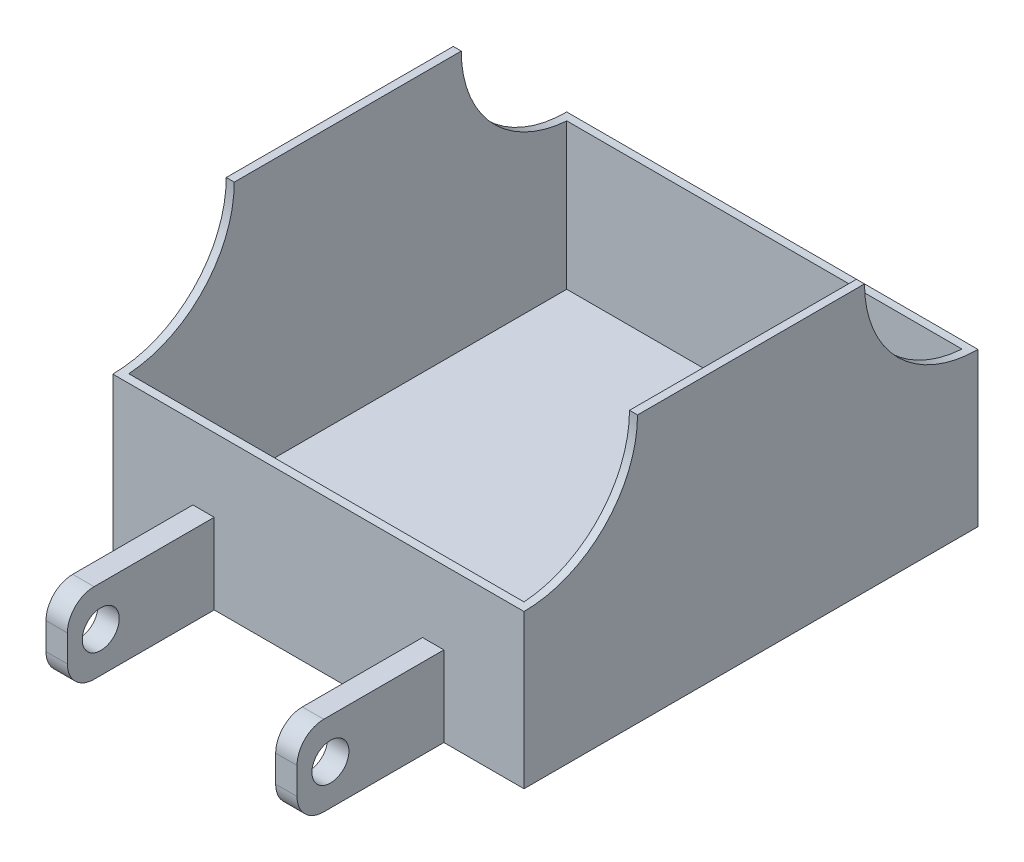
ISO-10303-21;
HEADER;
FILE_DESCRIPTION(('STEP AP214'),'2;1');
FILE_NAME('part.step','',(''),(''),'','','');
FILE_SCHEMA(('AUTOMOTIVE_DESIGN { 1 0 10303 214 1 1 1 1 }'));
ENDSEC;
DATA;
#1=APPLICATION_CONTEXT('core data for automotive mechanical design processes');
#2=APPLICATION_PROTOCOL_DEFINITION('international standard','automotive_design',2000,#1);
#3=PRODUCT_CONTEXT('',#1,'mechanical');
#4=PRODUCT('Part','Part','',(#3));
#5=PRODUCT_RELATED_PRODUCT_CATEGORY('part','',(#4));
#6=PRODUCT_DEFINITION_FORMATION('','',#4);
#7=PRODUCT_DEFINITION_CONTEXT('part definition',#1,'design');
#8=PRODUCT_DEFINITION('design','',#6,#7);
#9=PRODUCT_DEFINITION_SHAPE('','',#8);
#10=(LENGTH_UNIT() NAMED_UNIT(*) SI_UNIT(.MILLI.,.METRE.));
#11=(NAMED_UNIT(*) PLANE_ANGLE_UNIT() SI_UNIT($,.RADIAN.));
#12=(NAMED_UNIT(*) SI_UNIT($,.STERADIAN.) SOLID_ANGLE_UNIT());
#13=UNCERTAINTY_MEASURE_WITH_UNIT(LENGTH_MEASURE(1.E-05),#10,'distance_accuracy_value','');
#14=(GEOMETRIC_REPRESENTATION_CONTEXT(3) GLOBAL_UNCERTAINTY_ASSIGNED_CONTEXT((#13)) GLOBAL_UNIT_ASSIGNED_CONTEXT((#10,
#11,#12)) REPRESENTATION_CONTEXT('',''));
#15=CARTESIAN_POINT('',(0.,0.,0.));
#16=DIRECTION('',(0.,0.,1.));
#17=DIRECTION('',(1.,0.,0.));
#18=AXIS2_PLACEMENT_3D('',#15,#16,#17);
#19=CARTESIAN_POINT('',(154.,50.,85.));
#20=DIRECTION('',(0.,-1.,0.));
#21=DIRECTION('',(0.,0.,-1.));
#22=AXIS2_PLACEMENT_3D('',#19,#20,#21);
#23=PLANE('',#22);
#24=DIRECTION('',(0.,0.,1.));
#25=VECTOR('',#24,1.);
#26=CARTESIAN_POINT('',(154.,50.,85.));
#27=LINE('',#26,#25);
#28=CARTESIAN_POINT('',(154.,50.,-42.5));
#29=VERTEX_POINT('',#28);
#30=CARTESIAN_POINT('',(154.,50.,42.5));
#31=VERTEX_POINT('',#30);
#32=EDGE_CURVE('E209',#29,#31,#27,.T.);
#33=ORIENTED_EDGE('',*,*,#32,.F.);
#34=DIRECTION('',(1.,0.,0.));
#35=VECTOR('',#34,1.);
#36=CARTESIAN_POINT('',(-120.208152801713,50.,-42.5));
#37=LINE('',#36,#35);
#38=CARTESIAN_POINT('',(151.,50.,-42.5));
#39=VERTEX_POINT('',#38);
#40=EDGE_CURVE('E332',#29,#39,#37,.F.);
#41=ORIENTED_EDGE('',*,*,#40,.T.);
#42=DIRECTION('',(0.,0.,1.));
#43=VECTOR('',#42,1.);
#44=CARTESIAN_POINT('',(151.,50.,0.));
#45=LINE('',#44,#43);
#46=CARTESIAN_POINT('',(151.,50.,42.5));
#47=VERTEX_POINT('',#46);
#48=EDGE_CURVE('E211',#39,#47,#45,.T.);
#49=ORIENTED_EDGE('',*,*,#48,.T.);
#50=DIRECTION('',(1.,0.,0.));
#51=VECTOR('',#50,1.);
#52=CARTESIAN_POINT('',(-120.208152801713,50.,42.5));
#53=LINE('',#52,#51);
#54=EDGE_CURVE('E196',#47,#31,#53,.T.);
#55=ORIENTED_EDGE('',*,*,#54,.T.);
#56=EDGE_LOOP('',(#33,#41,#49,#55));
#57=FACE_BOUND('',#56,.T.);
#58=ADVANCED_FACE('F35',(#57),#23,.F.);
#59=CARTESIAN_POINT('',(30.,-19.9407530090241,140.));
#60=DIRECTION('',(0.,1.,0.));
#61=DIRECTION('',(0.,0.,1.));
#62=AXIS2_PLACEMENT_3D('',#59,#60,#61);
#63=PLANE('',#62);
#64=DIRECTION('',(0.,0.,-1.));
#65=VECTOR('',#64,1.);
#66=CARTESIAN_POINT('',(30.,-19.9407530090241,140.));
#67=LINE('',#66,#65);
#68=CARTESIAN_POINT('',(30.,-19.9407530090241,130.));
#69=VERTEX_POINT('',#68);
#70=CARTESIAN_POINT('',(30.,-19.9407530090241,85.));
#71=VERTEX_POINT('',#70);
#72=EDGE_CURVE('E383',#69,#71,#67,.T.);
#73=ORIENTED_EDGE('',*,*,#72,.F.);
#74=DIRECTION('',(1.,0.,0.));
#75=VECTOR('',#74,1.);
#76=CARTESIAN_POINT('',(38.,-19.9407530090241,130.));
#77=LINE('',#76,#75);
#78=CARTESIAN_POINT('',(38.,-19.9407530090241,130.));
#79=VERTEX_POINT('',#78);
#80=EDGE_CURVE('E268',#69,#79,#77,.T.);
#81=ORIENTED_EDGE('',*,*,#80,.T.);
#82=DIRECTION('',(0.,0.,1.));
#83=VECTOR('',#82,1.);
#84=CARTESIAN_POINT('',(38.,-19.9407530090241,85.));
#85=LINE('',#84,#83);
#86=CARTESIAN_POINT('',(38.,-19.9407530090241,85.));
#87=VERTEX_POINT('',#86);
#88=EDGE_CURVE('E364',#87,#79,#85,.T.);
#89=ORIENTED_EDGE('',*,*,#88,.F.);
#90=DIRECTION('',(1.,0.,0.));
#91=VECTOR('',#90,1.);
#92=CARTESIAN_POINT('',(30.,-19.9407530090241,85.));
#93=LINE('',#92,#91);
#94=EDGE_CURVE('E387',#71,#87,#93,.T.);
#95=ORIENTED_EDGE('',*,*,#94,.F.);
#96=EDGE_LOOP('',(#73,#81,#89,#95));
#97=FACE_BOUND('',#96,.T.);
#98=ADVANCED_FACE('F411',(#97),#63,.T.);
#99=CARTESIAN_POINT('',(0.,0.,140.));
#100=DIRECTION('',(0.,0.,-1.));
#101=DIRECTION('',(-1.,0.,0.));
#102=AXIS2_PLACEMENT_3D('',#99,#100,#101);
#103=PLANE('',#102);
#104=DIRECTION('',(0.,1.,0.));
#105=VECTOR('',#104,1.);
#106=CARTESIAN_POINT('',(30.,-50.,140.));
#107=LINE('',#106,#105);
#108=CARTESIAN_POINT('',(30.,-40.,140.));
#109=VERTEX_POINT('',#108);
#110=CARTESIAN_POINT('',(30.,-29.9407530090241,140.));
#111=VERTEX_POINT('',#110);
#112=EDGE_CURVE('E376',#109,#111,#107,.T.);
#113=ORIENTED_EDGE('',*,*,#112,.F.);
#114=DIRECTION('',(1.,0.,0.));
#115=VECTOR('',#114,1.);
#116=CARTESIAN_POINT('',(0.,-40.,140.));
#117=LINE('',#116,#115);
#118=CARTESIAN_POINT('',(38.,-40.,140.));
#119=VERTEX_POINT('',#118);
#120=EDGE_CURVE('E253',#109,#119,#117,.T.);
#121=ORIENTED_EDGE('',*,*,#120,.T.);
#122=DIRECTION('',(0.,-1.,0.));
#123=VECTOR('',#122,1.);
#124=CARTESIAN_POINT('',(38.,-50.,140.));
#125=LINE('',#124,#123);
#126=CARTESIAN_POINT('',(38.,-29.9407530090241,140.));
#127=VERTEX_POINT('',#126);
#128=EDGE_CURVE('E348',#127,#119,#125,.T.);
#129=ORIENTED_EDGE('',*,*,#128,.F.);
#130=DIRECTION('',(1.,0.,0.));
#131=VECTOR('',#130,1.);
#132=CARTESIAN_POINT('',(30.,-29.9407530090241,140.));
#133=LINE('',#132,#131);
#134=EDGE_CURVE('E246',#127,#111,#133,.F.);
#135=ORIENTED_EDGE('',*,*,#134,.T.);
#136=EDGE_LOOP('',(#113,#121,#129,#135));
#137=FACE_BOUND('',#136,.T.);
#138=ADVANCED_FACE('F474',(#137),#103,.F.);
#139=DIRECTION('',(0.,0.,1.));
#140=VECTOR('',#139,1.);
#141=CARTESIAN_POINT('',(3.,50.,0.));
#142=LINE('',#141,#140);
#143=CARTESIAN_POINT('',(3.,50.,-42.5));
#144=VERTEX_POINT('',#143);
#145=CARTESIAN_POINT('',(3.,50.,42.5));
#146=VERTEX_POINT('',#145);
#147=EDGE_CURVE('E294',#144,#146,#142,.T.);
#148=ORIENTED_EDGE('',*,*,#147,.F.);
#149=CARTESIAN_POINT('',(0.,50.,-42.5));
#150=VERTEX_POINT('',#149);
#151=EDGE_CURVE('E58',#144,#150,#37,.F.);
#152=ORIENTED_EDGE('',*,*,#151,.T.);
#153=DIRECTION('',(0.,0.,1.));
#154=VECTOR('',#153,1.);
#155=CARTESIAN_POINT('',(0.,50.,85.));
#156=LINE('',#155,#154);
#157=CARTESIAN_POINT('',(0.,50.,42.5));
#158=VERTEX_POINT('',#157);
#159=EDGE_CURVE('E233',#150,#158,#156,.T.);
#160=ORIENTED_EDGE('',*,*,#159,.T.);
#161=EDGE_CURVE('E214',#158,#146,#53,.T.);
#162=ORIENTED_EDGE('',*,*,#161,.T.);
#163=EDGE_LOOP('',(#148,#152,#160,#162));
#164=FACE_BOUND('',#163,.T.);
#165=ADVANCED_FACE('F467',(#164),#23,.F.);
#166=CARTESIAN_POINT('',(154.,-50.,-85.));
#167=DIRECTION('',(0.,0.,1.));
#168=DIRECTION('',(1.,0.,0.));
#169=AXIS2_PLACEMENT_3D('',#166,#167,#168);
#170=PLANE('',#169);
#171=DIRECTION('',(0.,1.,0.));
#172=VECTOR('',#171,1.);
#173=CARTESIAN_POINT('',(0.,-50.,-85.));
#174=LINE('',#173,#172);
#175=CARTESIAN_POINT('',(0.,-50.,-85.));
#176=VERTEX_POINT('',#175);
#177=CARTESIAN_POINT('',(0.,7.50000000000001,-85.));
#178=VERTEX_POINT('',#177);
#179=EDGE_CURVE('E230',#176,#178,#174,.T.);
#180=ORIENTED_EDGE('',*,*,#179,.T.);
#181=DIRECTION('',(1.,0.,0.));
#182=VECTOR('',#181,1.);
#183=CARTESIAN_POINT('',(-120.208152801713,7.50000000000001,-85.));
#184=LINE('',#183,#182);
#185=CARTESIAN_POINT('',(154.,7.50000000000001,-85.));
#186=VERTEX_POINT('',#185);
#187=EDGE_CURVE('E334',#178,#186,#184,.T.);
#188=ORIENTED_EDGE('',*,*,#187,.T.);
#189=DIRECTION('',(0.,1.,0.));
#190=VECTOR('',#189,1.);
#191=CARTESIAN_POINT('',(154.,-50.,-85.));
#192=LINE('',#191,#190);
#193=CARTESIAN_POINT('',(154.,-50.,-85.));
#194=VERTEX_POINT('',#193);
#195=EDGE_CURVE('E220',#194,#186,#192,.T.);
#196=ORIENTED_EDGE('',*,*,#195,.F.);
#197=DIRECTION('',(-1.,0.,0.));
#198=VECTOR('',#197,1.);
#199=CARTESIAN_POINT('',(154.,-50.,-85.));
#200=LINE('',#199,#198);
#201=EDGE_CURVE('E229',#194,#176,#200,.T.);
#202=ORIENTED_EDGE('',*,*,#201,.T.);
#203=EDGE_LOOP('',(#180,#188,#196,#202));
#204=FACE_BOUND('',#203,.T.);
#205=ADVANCED_FACE('F452',(#204),#170,.F.);
#206=CARTESIAN_POINT('',(154.,-50.,85.));
#207=DIRECTION('',(0.,0.,-1.));
#208=DIRECTION('',(-1.,0.,0.));
#209=AXIS2_PLACEMENT_3D('',#206,#207,#208);
#210=PLANE('',#209);
#211=DIRECTION('',(0.,-1.,0.));
#212=VECTOR('',#211,1.);
#213=CARTESIAN_POINT('',(154.,-50.,85.));
#214=LINE('',#213,#212);
#215=CARTESIAN_POINT('',(154.,7.49999999999999,85.));
#216=VERTEX_POINT('',#215);
#217=CARTESIAN_POINT('',(154.,-50.,85.));
#218=VERTEX_POINT('',#217);
#219=EDGE_CURVE('E219',#216,#218,#214,.T.);
#220=ORIENTED_EDGE('',*,*,#219,.F.);
#221=DIRECTION('',(1.,0.,0.));
#222=VECTOR('',#221,1.);
#223=CARTESIAN_POINT('',(-120.208152801713,7.49999999999999,85.));
#224=LINE('',#223,#222);
#225=CARTESIAN_POINT('',(0.,7.49999999999999,85.));
#226=VERTEX_POINT('',#225);
#227=EDGE_CURVE('E199',#216,#226,#224,.F.);
#228=ORIENTED_EDGE('',*,*,#227,.T.);
#229=DIRECTION('',(0.,-1.,0.));
#230=VECTOR('',#229,1.);
#231=CARTESIAN_POINT('',(0.,-50.,85.));
#232=LINE('',#231,#230);
#233=CARTESIAN_POINT('',(0.,-50.,85.));
#234=VERTEX_POINT('',#233);
#235=EDGE_CURVE('E237',#226,#234,#232,.T.);
#236=ORIENTED_EDGE('',*,*,#235,.T.);
#237=DIRECTION('',(-1.,0.,0.));
#238=VECTOR('',#237,1.);
#239=CARTESIAN_POINT('',(154.,-50.,85.));
#240=LINE('',#239,#238);
#241=CARTESIAN_POINT('',(30.,-50.,85.));
#242=VERTEX_POINT('',#241);
#243=EDGE_CURVE('E242',#242,#234,#240,.T.);
#244=ORIENTED_EDGE('',*,*,#243,.F.);
#245=DIRECTION('',(0.,1.,0.));
#246=VECTOR('',#245,1.);
#247=CARTESIAN_POINT('',(30.,-50.,85.));
#248=LINE('',#247,#246);
#249=EDGE_CURVE('E367',#242,#71,#248,.T.);
#250=ORIENTED_EDGE('',*,*,#249,.T.);
#251=ORIENTED_EDGE('',*,*,#94,.T.);
#252=DIRECTION('',(0.,-1.,0.));
#253=VECTOR('',#252,1.);
#254=CARTESIAN_POINT('',(38.,-50.,85.));
#255=LINE('',#254,#253);
#256=CARTESIAN_POINT('',(38.,-50.,85.));
#257=VERTEX_POINT('',#256);
#258=EDGE_CURVE('E349',#87,#257,#255,.T.);
#259=ORIENTED_EDGE('',*,*,#258,.T.);
#260=DIRECTION('',(1.,0.,0.));
#261=VECTOR('',#260,1.);
#262=CARTESIAN_POINT('',(38.,-50.,85.));
#263=LINE('',#262,#261);
#264=CARTESIAN_POINT('',(116.,-50.,85.));
#265=VERTEX_POINT('',#264);
#266=EDGE_CURVE('E352',#257,#265,#263,.T.);
#267=ORIENTED_EDGE('',*,*,#266,.T.);
#268=DIRECTION('',(0.,1.,0.));
#269=VECTOR('',#268,1.);
#270=CARTESIAN_POINT('',(116.,-50.,85.));
#271=LINE('',#270,#269);
#272=CARTESIAN_POINT('',(116.,-19.9407530090241,85.));
#273=VERTEX_POINT('',#272);
#274=EDGE_CURVE('E356',#265,#273,#271,.T.);
#275=ORIENTED_EDGE('',*,*,#274,.T.);
#276=CARTESIAN_POINT('',(124.,-19.9407530090241,85.));
#277=VERTEX_POINT('',#276);
#278=EDGE_CURVE('E386',#273,#277,#93,.T.);
#279=ORIENTED_EDGE('',*,*,#278,.T.);
#280=DIRECTION('',(0.,1.,0.));
#281=VECTOR('',#280,1.);
#282=CARTESIAN_POINT('',(124.,-50.,85.));
#283=LINE('',#282,#281);
#284=CARTESIAN_POINT('',(124.,-50.,85.));
#285=VERTEX_POINT('',#284);
#286=EDGE_CURVE('E380',#285,#277,#283,.T.);
#287=ORIENTED_EDGE('',*,*,#286,.F.);
#288=EDGE_CURVE('E243',#218,#285,#240,.T.);
#289=ORIENTED_EDGE('',*,*,#288,.F.);
#290=EDGE_LOOP('',(#220,#228,#236,#244,#250,#251,#259,#267,#275,#279,#287,#289));
#291=FACE_BOUND('',#290,.T.);
#292=ADVANCED_FACE('F408',(#291),#210,.F.);
#293=CARTESIAN_POINT('',(154.,-50.,85.));
#294=DIRECTION('',(0.,1.,0.));
#295=DIRECTION('',(0.,0.,1.));
#296=AXIS2_PLACEMENT_3D('',#293,#294,#295);
#297=PLANE('',#296);
#298=DIRECTION('',(0.,0.,1.));
#299=VECTOR('',#298,1.);
#300=CARTESIAN_POINT('',(38.,-50.,85.));
#301=LINE('',#300,#299);
#302=CARTESIAN_POINT('',(38.,-50.,130.));
#303=VERTEX_POINT('',#302);
#304=EDGE_CURVE('E359',#257,#303,#301,.T.);
#305=ORIENTED_EDGE('',*,*,#304,.T.);
#306=DIRECTION('',(1.,0.,0.));
#307=VECTOR('',#306,1.);
#308=CARTESIAN_POINT('',(154.,-50.,130.));
#309=LINE('',#308,#307);
#310=CARTESIAN_POINT('',(30.,-50.,130.));
#311=VERTEX_POINT('',#310);
#312=EDGE_CURVE('E262',#303,#311,#309,.F.);
#313=ORIENTED_EDGE('',*,*,#312,.T.);
#314=DIRECTION('',(0.,0.,-1.));
#315=VECTOR('',#314,1.);
#316=CARTESIAN_POINT('',(30.,-50.,140.));
#317=LINE('',#316,#315);
#318=EDGE_CURVE('E392',#311,#242,#317,.T.);
#319=ORIENTED_EDGE('',*,*,#318,.T.);
#320=ORIENTED_EDGE('',*,*,#243,.T.);
#321=DIRECTION('',(0.,0.,-1.));
#322=VECTOR('',#321,1.);
#323=CARTESIAN_POINT('',(0.,-50.,85.));
#324=LINE('',#323,#322);
#325=EDGE_CURVE('E224',#234,#176,#324,.T.);
#326=ORIENTED_EDGE('',*,*,#325,.T.);
#327=ORIENTED_EDGE('',*,*,#201,.F.);
#328=DIRECTION('',(0.,0.,-1.));
#329=VECTOR('',#328,1.);
#330=CARTESIAN_POINT('',(154.,-50.,85.));
#331=LINE('',#330,#329);
#332=EDGE_CURVE('E222',#218,#194,#331,.T.);
#333=ORIENTED_EDGE('',*,*,#332,.F.);
#334=ORIENTED_EDGE('',*,*,#288,.T.);
#335=DIRECTION('',(0.,0.,-1.));
#336=VECTOR('',#335,1.);
#337=CARTESIAN_POINT('',(124.,-50.,140.));
#338=LINE('',#337,#336);
#339=CARTESIAN_POINT('',(124.,-50.,130.));
#340=VERTEX_POINT('',#339);
#341=EDGE_CURVE('E394',#340,#285,#338,.T.);
#342=ORIENTED_EDGE('',*,*,#341,.F.);
#343=DIRECTION('',(1.,0.,0.));
#344=VECTOR('',#343,1.);
#345=CARTESIAN_POINT('',(154.,-50.,130.));
#346=LINE('',#345,#344);
#347=CARTESIAN_POINT('',(116.,-50.,130.));
#348=VERTEX_POINT('',#347);
#349=EDGE_CURVE('E260',#340,#348,#346,.F.);
#350=ORIENTED_EDGE('',*,*,#349,.T.);
#351=DIRECTION('',(0.,0.,1.));
#352=VECTOR('',#351,1.);
#353=CARTESIAN_POINT('',(116.,-50.,85.));
#354=LINE('',#353,#352);
#355=EDGE_CURVE('E371',#265,#348,#354,.T.);
#356=ORIENTED_EDGE('',*,*,#355,.F.);
#357=ORIENTED_EDGE('',*,*,#266,.F.);
#358=EDGE_LOOP('',(#305,#313,#319,#320,#326,#327,#333,#334,#342,#350,#356,#357));
#359=FACE_BOUND('',#358,.T.);
#360=ADVANCED_FACE('F418',(#359),#297,.F.);
#361=CARTESIAN_POINT('',(154.,0.,0.));
#362=DIRECTION('',(-1.,0.,0.));
#363=DIRECTION('',(0.,0.,1.));
#364=AXIS2_PLACEMENT_3D('',#361,#362,#363);
#365=PLANE('',#364);
#366=ORIENTED_EDGE('',*,*,#195,.T.);
#367=CARTESIAN_POINT('',(154.,50.,-85.));
#368=DIRECTION('',(1.,0.,0.));
#369=DIRECTION('',(0.,0.,-1.));
#370=AXIS2_PLACEMENT_3D('',#367,#368,#369);
#371=CIRCLE('',#370,42.5);
#372=EDGE_CURVE('E218',#29,#186,#371,.T.);
#373=ORIENTED_EDGE('',*,*,#372,.F.);
#374=ORIENTED_EDGE('',*,*,#32,.T.);
#375=CARTESIAN_POINT('',(154.,50.,85.));
#376=DIRECTION('',(1.,0.,0.));
#377=DIRECTION('',(0.,0.,-1.));
#378=AXIS2_PLACEMENT_3D('',#375,#376,#377);
#379=CIRCLE('',#378,42.5);
#380=EDGE_CURVE('E193',#216,#31,#379,.T.);
#381=ORIENTED_EDGE('',*,*,#380,.F.);
#382=ORIENTED_EDGE('',*,*,#219,.T.);
#383=ORIENTED_EDGE('',*,*,#332,.T.);
#384=EDGE_LOOP('',(#366,#373,#374,#381,#382,#383));
#385=FACE_BOUND('',#384,.T.);
#386=ADVANCED_FACE('F217',(#385),#365,.F.);
#387=CARTESIAN_POINT('',(0.,0.,0.));
#388=DIRECTION('',(-1.,0.,0.));
#389=DIRECTION('',(0.,0.,1.));
#390=AXIS2_PLACEMENT_3D('',#387,#388,#389);
#391=PLANE('',#390);
#392=CARTESIAN_POINT('',(0.,50.,-85.));
#393=DIRECTION('',(-1.,0.,0.));
#394=DIRECTION('',(0.,0.,1.));
#395=AXIS2_PLACEMENT_3D('',#392,#393,#394);
#396=CIRCLE('',#395,42.5);
#397=EDGE_CURVE('E455',#150,#178,#396,.F.);
#398=ORIENTED_EDGE('',*,*,#397,.T.);
#399=ORIENTED_EDGE('',*,*,#179,.F.);
#400=ORIENTED_EDGE('',*,*,#325,.F.);
#401=ORIENTED_EDGE('',*,*,#235,.F.);
#402=CARTESIAN_POINT('',(0.,50.,85.));
#403=DIRECTION('',(-1.,0.,0.));
#404=DIRECTION('',(0.,0.,1.));
#405=AXIS2_PLACEMENT_3D('',#402,#403,#404);
#406=CIRCLE('',#405,42.5);
#407=EDGE_CURVE('E203',#226,#158,#406,.F.);
#408=ORIENTED_EDGE('',*,*,#407,.T.);
#409=ORIENTED_EDGE('',*,*,#159,.F.);
#410=EDGE_LOOP('',(#398,#399,#400,#401,#408,#409));
#411=FACE_BOUND('',#410,.T.);
#412=ADVANCED_FACE('F458',(#411),#391,.T.);
#413=CARTESIAN_POINT('',(154.,-50.,-82.));
#414=DIRECTION('',(0.,0.,1.));
#415=DIRECTION('',(1.,0.,0.));
#416=AXIS2_PLACEMENT_3D('',#413,#414,#415);
#417=PLANE('',#416);
#418=DIRECTION('',(1.,0.,0.));
#419=VECTOR('',#418,1.);
#420=CARTESIAN_POINT('',(-120.208152801713,7.60601457753708,-82.));
#421=LINE('',#420,#419);
#422=CARTESIAN_POINT('',(3.,7.60601457753708,-82.));
#423=VERTEX_POINT('',#422);
#424=CARTESIAN_POINT('',(151.,7.60601457753708,-82.));
#425=VERTEX_POINT('',#424);
#426=EDGE_CURVE('E336',#423,#425,#421,.T.);
#427=ORIENTED_EDGE('',*,*,#426,.F.);
#428=DIRECTION('',(0.,1.,0.));
#429=VECTOR('',#428,1.);
#430=CARTESIAN_POINT('',(3.,0.,-82.));
#431=LINE('',#430,#429);
#432=CARTESIAN_POINT('',(3.,-47.,-82.));
#433=VERTEX_POINT('',#432);
#434=EDGE_CURVE('E305',#433,#423,#431,.T.);
#435=ORIENTED_EDGE('',*,*,#434,.F.);
#436=DIRECTION('',(-1.,0.,0.));
#437=VECTOR('',#436,1.);
#438=CARTESIAN_POINT('',(154.,-47.,-82.));
#439=LINE('',#438,#437);
#440=CARTESIAN_POINT('',(151.,-47.,-82.));
#441=VERTEX_POINT('',#440);
#442=EDGE_CURVE('E321',#441,#433,#439,.T.);
#443=ORIENTED_EDGE('',*,*,#442,.F.);
#444=DIRECTION('',(0.,1.,0.));
#445=VECTOR('',#444,1.);
#446=CARTESIAN_POINT('',(151.,0.,-82.));
#447=LINE('',#446,#445);
#448=EDGE_CURVE('E303',#441,#425,#447,.T.);
#449=ORIENTED_EDGE('',*,*,#448,.T.);
#450=EDGE_LOOP('',(#427,#435,#443,#449));
#451=FACE_BOUND('',#450,.T.);
#452=ADVANCED_FACE('F328',(#451),#417,.T.);
#453=CARTESIAN_POINT('',(154.,-50.,82.));
#454=DIRECTION('',(0.,0.,-1.));
#455=DIRECTION('',(-1.,0.,0.));
#456=AXIS2_PLACEMENT_3D('',#453,#454,#455);
#457=PLANE('',#456);
#458=DIRECTION('',(1.,0.,0.));
#459=VECTOR('',#458,1.);
#460=CARTESIAN_POINT('',(-120.208152801713,7.60601457753705,82.));
#461=LINE('',#460,#459);
#462=CARTESIAN_POINT('',(151.,7.60601457753705,82.));
#463=VERTEX_POINT('',#462);
#464=CARTESIAN_POINT('',(3.,7.60601457753705,82.));
#465=VERTEX_POINT('',#464);
#466=EDGE_CURVE('E50',#463,#465,#461,.F.);
#467=ORIENTED_EDGE('',*,*,#466,.F.);
#468=DIRECTION('',(0.,-1.,0.));
#469=VECTOR('',#468,1.);
#470=CARTESIAN_POINT('',(151.,0.,82.));
#471=LINE('',#470,#469);
#472=CARTESIAN_POINT('',(151.,-47.,82.));
#473=VERTEX_POINT('',#472);
#474=EDGE_CURVE('E310',#463,#473,#471,.T.);
#475=ORIENTED_EDGE('',*,*,#474,.T.);
#476=DIRECTION('',(-1.,0.,0.));
#477=VECTOR('',#476,1.);
#478=CARTESIAN_POINT('',(154.,-47.,82.));
#479=LINE('',#478,#477);
#480=CARTESIAN_POINT('',(3.,-47.,82.));
#481=VERTEX_POINT('',#480);
#482=EDGE_CURVE('E234',#473,#481,#479,.T.);
#483=ORIENTED_EDGE('',*,*,#482,.T.);
#484=DIRECTION('',(0.,-1.,0.));
#485=VECTOR('',#484,1.);
#486=CARTESIAN_POINT('',(3.,0.,82.));
#487=LINE('',#486,#485);
#488=EDGE_CURVE('E291',#465,#481,#487,.T.);
#489=ORIENTED_EDGE('',*,*,#488,.F.);
#490=EDGE_LOOP('',(#467,#475,#483,#489));
#491=FACE_BOUND('',#490,.T.);
#492=ADVANCED_FACE('F297',(#491),#457,.T.);
#493=CARTESIAN_POINT('',(154.,-47.,85.));
#494=DIRECTION('',(0.,1.,0.));
#495=DIRECTION('',(0.,0.,1.));
#496=AXIS2_PLACEMENT_3D('',#493,#494,#495);
#497=PLANE('',#496);
#498=DIRECTION('',(0.,0.,-1.));
#499=VECTOR('',#498,1.);
#500=CARTESIAN_POINT('',(3.,-47.,0.));
#501=LINE('',#500,#499);
#502=EDGE_CURVE('E301',#481,#433,#501,.T.);
#503=ORIENTED_EDGE('',*,*,#502,.F.);
#504=ORIENTED_EDGE('',*,*,#482,.F.);
#505=DIRECTION('',(0.,0.,-1.));
#506=VECTOR('',#505,1.);
#507=CARTESIAN_POINT('',(151.,-47.,0.));
#508=LINE('',#507,#506);
#509=EDGE_CURVE('E311',#473,#441,#508,.T.);
#510=ORIENTED_EDGE('',*,*,#509,.T.);
#511=ORIENTED_EDGE('',*,*,#442,.T.);
#512=EDGE_LOOP('',(#503,#504,#510,#511));
#513=FACE_BOUND('',#512,.T.);
#514=ADVANCED_FACE('F325',(#513),#497,.T.);
#515=CARTESIAN_POINT('',(151.,0.,0.));
#516=DIRECTION('',(-1.,0.,0.));
#517=DIRECTION('',(0.,0.,1.));
#518=AXIS2_PLACEMENT_3D('',#515,#516,#517);
#519=PLANE('',#518);
#520=CARTESIAN_POINT('',(151.,50.,-85.));
#521=DIRECTION('',(-1.,0.,0.));
#522=DIRECTION('',(0.,0.,1.));
#523=AXIS2_PLACEMENT_3D('',#520,#521,#522);
#524=CIRCLE('',#523,42.5);
#525=EDGE_CURVE('E331',#425,#39,#524,.T.);
#526=ORIENTED_EDGE('',*,*,#525,.F.);
#527=ORIENTED_EDGE('',*,*,#448,.F.);
#528=ORIENTED_EDGE('',*,*,#509,.F.);
#529=ORIENTED_EDGE('',*,*,#474,.F.);
#530=CARTESIAN_POINT('',(151.,50.,85.));
#531=DIRECTION('',(-1.,0.,0.));
#532=DIRECTION('',(0.,0.,1.));
#533=AXIS2_PLACEMENT_3D('',#530,#531,#532);
#534=CIRCLE('',#533,42.5);
#535=EDGE_CURVE('E212',#47,#463,#534,.T.);
#536=ORIENTED_EDGE('',*,*,#535,.F.);
#537=ORIENTED_EDGE('',*,*,#48,.F.);
#538=EDGE_LOOP('',(#526,#527,#528,#529,#536,#537));
#539=FACE_BOUND('',#538,.T.);
#540=ADVANCED_FACE('F330',(#539),#519,.T.);
#541=CARTESIAN_POINT('',(3.,0.,0.));
#542=DIRECTION('',(-1.,0.,0.));
#543=DIRECTION('',(0.,0.,1.));
#544=AXIS2_PLACEMENT_3D('',#541,#542,#543);
#545=PLANE('',#544);
#546=ORIENTED_EDGE('',*,*,#434,.T.);
#547=CARTESIAN_POINT('',(3.,50.,-85.));
#548=DIRECTION('',(-1.,0.,0.));
#549=DIRECTION('',(0.,0.,1.));
#550=AXIS2_PLACEMENT_3D('',#547,#548,#549);
#551=CIRCLE('',#550,42.5);
#552=EDGE_CURVE('E11',#423,#144,#551,.T.);
#553=ORIENTED_EDGE('',*,*,#552,.T.);
#554=ORIENTED_EDGE('',*,*,#147,.T.);
#555=CARTESIAN_POINT('',(3.,50.,85.));
#556=DIRECTION('',(-1.,0.,0.));
#557=DIRECTION('',(0.,0.,1.));
#558=AXIS2_PLACEMENT_3D('',#555,#556,#557);
#559=CIRCLE('',#558,42.5);
#560=EDGE_CURVE('E43',#146,#465,#559,.T.);
#561=ORIENTED_EDGE('',*,*,#560,.T.);
#562=ORIENTED_EDGE('',*,*,#488,.T.);
#563=ORIENTED_EDGE('',*,*,#502,.T.);
#564=EDGE_LOOP('',(#546,#553,#554,#561,#562,#563));
#565=FACE_BOUND('',#564,.T.);
#566=ADVANCED_FACE('F290',(#565),#545,.F.);
#567=CARTESIAN_POINT('',(30.,-50.,140.));
#568=DIRECTION('',(-1.,0.,0.));
#569=DIRECTION('',(0.,0.,1.));
#570=AXIS2_PLACEMENT_3D('',#567,#568,#569);
#571=PLANE('',#570);
#572=CARTESIAN_POINT('',(30.,-34.970376504512,127.5));
#573=DIRECTION('',(1.,0.,0.));
#574=DIRECTION('',(0.,0.,-1.));
#575=AXIS2_PLACEMENT_3D('',#572,#573,#574);
#576=CIRCLE('',#575,6.925);
#577=CARTESIAN_POINT('',(30.,-34.970376504512,120.575));
#578=VERTEX_POINT('',#577);
#579=EDGE_CURVE('E251',#578,#578,#576,.T.);
#580=ORIENTED_EDGE('',*,*,#579,.T.);
#581=EDGE_LOOP('',(#580));
#582=FACE_BOUND('',#581,.T.);
#583=ORIENTED_EDGE('',*,*,#318,.F.);
#584=CARTESIAN_POINT('',(30.,-40.,130.));
#585=DIRECTION('',(-1.,0.,0.));
#586=DIRECTION('',(0.,0.,1.));
#587=AXIS2_PLACEMENT_3D('',#584,#585,#586);
#588=CIRCLE('',#587,10.);
#589=EDGE_CURVE('E266',#311,#109,#588,.T.);
#590=ORIENTED_EDGE('',*,*,#589,.T.);
#591=ORIENTED_EDGE('',*,*,#112,.T.);
#592=CARTESIAN_POINT('',(30.,-29.9407530090241,130.));
#593=DIRECTION('',(-1.,0.,0.));
#594=DIRECTION('',(0.,0.,1.));
#595=AXIS2_PLACEMENT_3D('',#592,#593,#594);
#596=CIRCLE('',#595,10.);
#597=EDGE_CURVE('E264',#111,#69,#596,.T.);
#598=ORIENTED_EDGE('',*,*,#597,.T.);
#599=ORIENTED_EDGE('',*,*,#72,.T.);
#600=ORIENTED_EDGE('',*,*,#249,.F.);
#601=EDGE_LOOP('',(#583,#590,#591,#598,#599,#600));
#602=FACE_BOUND('',#601,.T.);
#603=ADVANCED_FACE('F401',(#582,#602),#571,.T.);
#604=CARTESIAN_POINT('',(124.,-50.,140.));
#605=DIRECTION('',(-1.,0.,0.));
#606=DIRECTION('',(0.,0.,1.));
#607=AXIS2_PLACEMENT_3D('',#604,#605,#606);
#608=PLANE('',#607);
#609=CARTESIAN_POINT('',(124.,-34.970376504512,127.5));
#610=DIRECTION('',(1.,0.,0.));
#611=DIRECTION('',(0.,0.,-1.));
#612=AXIS2_PLACEMENT_3D('',#609,#610,#611);
#613=CIRCLE('',#612,6.925);
#614=CARTESIAN_POINT('',(124.,-34.970376504512,120.575));
#615=VERTEX_POINT('',#614);
#616=EDGE_CURVE('E341',#615,#615,#613,.T.);
#617=ORIENTED_EDGE('',*,*,#616,.F.);
#618=EDGE_LOOP('',(#617));
#619=FACE_BOUND('',#618,.T.);
#620=DIRECTION('',(0.,0.,-1.));
#621=VECTOR('',#620,1.);
#622=CARTESIAN_POINT('',(124.,-19.9407530090241,140.));
#623=LINE('',#622,#621);
#624=CARTESIAN_POINT('',(124.,-19.9407530090241,130.));
#625=VERTEX_POINT('',#624);
#626=EDGE_CURVE('E396',#625,#277,#623,.T.);
#627=ORIENTED_EDGE('',*,*,#626,.F.);
#628=CARTESIAN_POINT('',(124.,-29.9407530090241,130.));
#629=DIRECTION('',(-1.,0.,0.));
#630=DIRECTION('',(0.,0.,1.));
#631=AXIS2_PLACEMENT_3D('',#628,#629,#630);
#632=CIRCLE('',#631,10.);
#633=CARTESIAN_POINT('',(124.,-29.9407530090241,140.));
#634=VERTEX_POINT('',#633);
#635=EDGE_CURVE('E276',#625,#634,#632,.F.);
#636=ORIENTED_EDGE('',*,*,#635,.T.);
#637=DIRECTION('',(0.,1.,0.));
#638=VECTOR('',#637,1.);
#639=CARTESIAN_POINT('',(124.,-50.,140.));
#640=LINE('',#639,#638);
#641=CARTESIAN_POINT('',(124.,-40.,140.));
#642=VERTEX_POINT('',#641);
#643=EDGE_CURVE('E379',#642,#634,#640,.T.);
#644=ORIENTED_EDGE('',*,*,#643,.F.);
#645=CARTESIAN_POINT('',(124.,-40.,130.));
#646=DIRECTION('',(-1.,0.,0.));
#647=DIRECTION('',(0.,0.,1.));
#648=AXIS2_PLACEMENT_3D('',#645,#646,#647);
#649=CIRCLE('',#648,10.);
#650=EDGE_CURVE('E274',#642,#340,#649,.F.);
#651=ORIENTED_EDGE('',*,*,#650,.T.);
#652=ORIENTED_EDGE('',*,*,#341,.T.);
#653=ORIENTED_EDGE('',*,*,#286,.T.);
#654=EDGE_LOOP('',(#627,#636,#644,#651,#652,#653));
#655=FACE_BOUND('',#654,.T.);
#656=ADVANCED_FACE('F434',(#619,#655),#608,.F.);
#657=DIRECTION('',(0.,0.,1.));
#658=VECTOR('',#657,1.);
#659=CARTESIAN_POINT('',(116.,-19.9407530090241,85.));
#660=LINE('',#659,#658);
#661=CARTESIAN_POINT('',(116.,-19.9407530090241,130.));
#662=VERTEX_POINT('',#661);
#663=EDGE_CURVE('E368',#273,#662,#660,.T.);
#664=ORIENTED_EDGE('',*,*,#663,.T.);
#665=DIRECTION('',(1.,0.,0.));
#666=VECTOR('',#665,1.);
#667=CARTESIAN_POINT('',(124.,-19.9407530090241,130.));
#668=LINE('',#667,#666);
#669=EDGE_CURVE('E271',#662,#625,#668,.T.);
#670=ORIENTED_EDGE('',*,*,#669,.T.);
#671=ORIENTED_EDGE('',*,*,#626,.T.);
#672=ORIENTED_EDGE('',*,*,#278,.F.);
#673=EDGE_LOOP('',(#664,#670,#671,#672));
#674=FACE_BOUND('',#673,.T.);
#675=ADVANCED_FACE('F440',(#674),#63,.T.);
#676=ORIENTED_EDGE('',*,*,#643,.T.);
#677=DIRECTION('',(1.,0.,0.));
#678=VECTOR('',#677,1.);
#679=CARTESIAN_POINT('',(116.,-29.9407530090241,140.));
#680=LINE('',#679,#678);
#681=CARTESIAN_POINT('',(116.,-29.9407530090241,140.));
#682=VERTEX_POINT('',#681);
#683=EDGE_CURVE('E281',#634,#682,#680,.F.);
#684=ORIENTED_EDGE('',*,*,#683,.T.);
#685=DIRECTION('',(0.,1.,0.));
#686=VECTOR('',#685,1.);
#687=CARTESIAN_POINT('',(116.,-50.,140.));
#688=LINE('',#687,#686);
#689=CARTESIAN_POINT('',(116.,-40.,140.));
#690=VERTEX_POINT('',#689);
#691=EDGE_CURVE('E353',#690,#682,#688,.T.);
#692=ORIENTED_EDGE('',*,*,#691,.F.);
#693=DIRECTION('',(1.,0.,0.));
#694=VECTOR('',#693,1.);
#695=CARTESIAN_POINT('',(0.,-40.,140.));
#696=LINE('',#695,#694);
#697=EDGE_CURVE('E278',#690,#642,#696,.T.);
#698=ORIENTED_EDGE('',*,*,#697,.T.);
#699=EDGE_LOOP('',(#676,#684,#692,#698));
#700=FACE_BOUND('',#699,.T.);
#701=ADVANCED_FACE('F430',(#700),#103,.F.);
#702=CARTESIAN_POINT('',(38.,-50.,85.));
#703=DIRECTION('',(-1.,0.,0.));
#704=DIRECTION('',(0.,0.,1.));
#705=AXIS2_PLACEMENT_3D('',#702,#703,#704);
#706=PLANE('',#705);
#707=CARTESIAN_POINT('',(38.,-34.970376504512,127.5));
#708=DIRECTION('',(-1.,0.,0.));
#709=DIRECTION('',(0.,0.,1.));
#710=AXIS2_PLACEMENT_3D('',#707,#708,#709);
#711=CIRCLE('',#710,6.925);
#712=CARTESIAN_POINT('',(38.,-34.970376504512,134.425));
#713=VERTEX_POINT('',#712);
#714=EDGE_CURVE('E250',#713,#713,#711,.T.);
#715=ORIENTED_EDGE('',*,*,#714,.T.);
#716=EDGE_LOOP('',(#715));
#717=FACE_BOUND('',#716,.T.);
#718=ORIENTED_EDGE('',*,*,#128,.T.);
#719=CARTESIAN_POINT('',(38.,-40.,130.));
#720=DIRECTION('',(-1.,0.,0.));
#721=DIRECTION('',(0.,0.,1.));
#722=AXIS2_PLACEMENT_3D('',#719,#720,#721);
#723=CIRCLE('',#722,10.);
#724=EDGE_CURVE('E258',#119,#303,#723,.F.);
#725=ORIENTED_EDGE('',*,*,#724,.T.);
#726=ORIENTED_EDGE('',*,*,#304,.F.);
#727=ORIENTED_EDGE('',*,*,#258,.F.);
#728=ORIENTED_EDGE('',*,*,#88,.T.);
#729=CARTESIAN_POINT('',(38.,-29.9407530090241,130.));
#730=DIRECTION('',(-1.,0.,0.));
#731=DIRECTION('',(0.,0.,1.));
#732=AXIS2_PLACEMENT_3D('',#729,#730,#731);
#733=CIRCLE('',#732,10.);
#734=EDGE_CURVE('E256',#79,#127,#733,.F.);
#735=ORIENTED_EDGE('',*,*,#734,.T.);
#736=EDGE_LOOP('',(#718,#725,#726,#727,#728,#735));
#737=FACE_BOUND('',#736,.T.);
#738=ADVANCED_FACE('F413',(#717,#737),#706,.F.);
#739=CARTESIAN_POINT('',(116.,-50.,85.));
#740=DIRECTION('',(1.,0.,0.));
#741=DIRECTION('',(0.,0.,-1.));
#742=AXIS2_PLACEMENT_3D('',#739,#740,#741);
#743=PLANE('',#742);
#744=CARTESIAN_POINT('',(116.,-34.970376504512,127.5));
#745=DIRECTION('',(1.,0.,0.));
#746=DIRECTION('',(0.,0.,-1.));
#747=AXIS2_PLACEMENT_3D('',#744,#745,#746);
#748=CIRCLE('',#747,6.925);
#749=CARTESIAN_POINT('',(116.,-34.970376504512,120.575));
#750=VERTEX_POINT('',#749);
#751=EDGE_CURVE('E247',#750,#750,#748,.T.);
#752=ORIENTED_EDGE('',*,*,#751,.T.);
#753=EDGE_LOOP('',(#752));
#754=FACE_BOUND('',#753,.T.);
#755=ORIENTED_EDGE('',*,*,#691,.T.);
#756=CARTESIAN_POINT('',(116.,-29.9407530090241,130.));
#757=DIRECTION('',(1.,0.,0.));
#758=DIRECTION('',(0.,0.,-1.));
#759=AXIS2_PLACEMENT_3D('',#756,#757,#758);
#760=CIRCLE('',#759,10.);
#761=EDGE_CURVE('E285',#682,#662,#760,.F.);
#762=ORIENTED_EDGE('',*,*,#761,.T.);
#763=ORIENTED_EDGE('',*,*,#663,.F.);
#764=ORIENTED_EDGE('',*,*,#274,.F.);
#765=ORIENTED_EDGE('',*,*,#355,.T.);
#766=CARTESIAN_POINT('',(116.,-40.,130.));
#767=DIRECTION('',(1.,0.,0.));
#768=DIRECTION('',(0.,0.,-1.));
#769=AXIS2_PLACEMENT_3D('',#766,#767,#768);
#770=CIRCLE('',#769,10.);
#771=EDGE_CURVE('E283',#348,#690,#770,.F.);
#772=ORIENTED_EDGE('',*,*,#771,.T.);
#773=EDGE_LOOP('',(#755,#762,#763,#764,#765,#772));
#774=FACE_BOUND('',#773,.T.);
#775=ADVANCED_FACE('F424',(#754,#774),#743,.F.);
#776=CARTESIAN_POINT('',(30.,-34.970376504512,127.5));
#777=DIRECTION('',(1.,0.,0.));
#778=DIRECTION('',(0.,0.,-1.));
#779=AXIS2_PLACEMENT_3D('',#776,#777,#778);
#780=CYLINDRICAL_SURFACE('',#779,6.925);
#781=ORIENTED_EDGE('',*,*,#616,.T.);
#782=EDGE_LOOP('',(#781));
#783=FACE_BOUND('',#782,.T.);
#784=ORIENTED_EDGE('',*,*,#751,.F.);
#785=EDGE_LOOP('',(#784));
#786=FACE_BOUND('',#785,.T.);
#787=ADVANCED_FACE('F604',(#783,#786),#780,.F.);
#788=ORIENTED_EDGE('',*,*,#579,.F.);
#789=EDGE_LOOP('',(#788));
#790=FACE_BOUND('',#789,.T.);
#791=ORIENTED_EDGE('',*,*,#714,.F.);
#792=EDGE_LOOP('',(#791));
#793=FACE_BOUND('',#792,.T.);
#794=ADVANCED_FACE('F484',(#790,#793),#780,.F.);
#795=CARTESIAN_POINT('',(0.,-40.,130.));
#796=DIRECTION('',(1.,0.,0.));
#797=DIRECTION('',(0.,0.,-1.));
#798=AXIS2_PLACEMENT_3D('',#795,#796,#797);
#799=CYLINDRICAL_SURFACE('',#798,10.);
#800=ORIENTED_EDGE('',*,*,#589,.F.);
#801=ORIENTED_EDGE('',*,*,#312,.F.);
#802=ORIENTED_EDGE('',*,*,#724,.F.);
#803=ORIENTED_EDGE('',*,*,#120,.F.);
#804=EDGE_LOOP('',(#800,#801,#802,#803));
#805=FACE_BOUND('',#804,.T.);
#806=ADVANCED_FACE('F472',(#805),#799,.T.);
#807=CARTESIAN_POINT('',(30.,-29.9407530090241,130.));
#808=DIRECTION('',(-1.,0.,0.));
#809=DIRECTION('',(0.,0.,1.));
#810=AXIS2_PLACEMENT_3D('',#807,#808,#809);
#811=CYLINDRICAL_SURFACE('',#810,10.);
#812=ORIENTED_EDGE('',*,*,#597,.F.);
#813=ORIENTED_EDGE('',*,*,#134,.F.);
#814=ORIENTED_EDGE('',*,*,#734,.F.);
#815=ORIENTED_EDGE('',*,*,#80,.F.);
#816=EDGE_LOOP('',(#812,#813,#814,#815));
#817=FACE_BOUND('',#816,.T.);
#818=ADVANCED_FACE('F477',(#817),#811,.T.);
#819=CARTESIAN_POINT('',(30.,-29.9407530090241,130.));
#820=DIRECTION('',(-1.,0.,0.));
#821=DIRECTION('',(0.,0.,1.));
#822=AXIS2_PLACEMENT_3D('',#819,#820,#821);
#823=CYLINDRICAL_SURFACE('',#822,10.);
#824=ORIENTED_EDGE('',*,*,#761,.F.);
#825=ORIENTED_EDGE('',*,*,#683,.F.);
#826=ORIENTED_EDGE('',*,*,#635,.F.);
#827=ORIENTED_EDGE('',*,*,#669,.F.);
#828=EDGE_LOOP('',(#824,#825,#826,#827));
#829=FACE_BOUND('',#828,.T.);
#830=ADVANCED_FACE('F438',(#829),#823,.T.);
#831=CARTESIAN_POINT('',(0.,-40.,130.));
#832=DIRECTION('',(1.,0.,0.));
#833=DIRECTION('',(0.,0.,-1.));
#834=AXIS2_PLACEMENT_3D('',#831,#832,#833);
#835=CYLINDRICAL_SURFACE('',#834,10.);
#836=ORIENTED_EDGE('',*,*,#771,.F.);
#837=ORIENTED_EDGE('',*,*,#349,.F.);
#838=ORIENTED_EDGE('',*,*,#650,.F.);
#839=ORIENTED_EDGE('',*,*,#697,.F.);
#840=EDGE_LOOP('',(#836,#837,#838,#839));
#841=FACE_BOUND('',#840,.T.);
#842=ADVANCED_FACE('F37',(#841),#835,.T.);
#843=CARTESIAN_POINT('',(-120.208152801713,50.,85.));
#844=DIRECTION('',(1.,0.,0.));
#845=DIRECTION('',(0.,0.,-1.));
#846=AXIS2_PLACEMENT_3D('',#843,#844,#845);
#847=CYLINDRICAL_SURFACE('',#846,42.5);
#848=ORIENTED_EDGE('',*,*,#380,.T.);
#849=ORIENTED_EDGE('',*,*,#54,.F.);
#850=ORIENTED_EDGE('',*,*,#535,.T.);
#851=ORIENTED_EDGE('',*,*,#466,.T.);
#852=ORIENTED_EDGE('',*,*,#560,.F.);
#853=ORIENTED_EDGE('',*,*,#161,.F.);
#854=ORIENTED_EDGE('',*,*,#407,.F.);
#855=ORIENTED_EDGE('',*,*,#227,.F.);
#856=EDGE_LOOP('',(#848,#849,#850,#851,#852,#853,#854,#855));
#857=FACE_BOUND('',#856,.T.);
#858=ADVANCED_FACE('F195',(#857),#847,.F.);
#859=CARTESIAN_POINT('',(-120.208152801713,50.,-85.));
#860=DIRECTION('',(1.,0.,0.));
#861=DIRECTION('',(0.,0.,-1.));
#862=AXIS2_PLACEMENT_3D('',#859,#860,#861);
#863=CYLINDRICAL_SURFACE('',#862,42.5);
#864=ORIENTED_EDGE('',*,*,#397,.F.);
#865=ORIENTED_EDGE('',*,*,#151,.F.);
#866=ORIENTED_EDGE('',*,*,#552,.F.);
#867=ORIENTED_EDGE('',*,*,#426,.T.);
#868=ORIENTED_EDGE('',*,*,#525,.T.);
#869=ORIENTED_EDGE('',*,*,#40,.F.);
#870=ORIENTED_EDGE('',*,*,#372,.T.);
#871=ORIENTED_EDGE('',*,*,#187,.F.);
#872=EDGE_LOOP('',(#864,#865,#866,#867,#868,#869,#870,#871));
#873=FACE_BOUND('',#872,.T.);
#874=ADVANCED_FACE('F454',(#873),#863,.F.);
#875=CLOSED_SHELL('',(#58,#98,#138,#165,#205,#292,#360,#386,#412,#452,#492,#514,#540,#566,#603,
#656,#675,#701,#738,#775,#787,#794,#806,#818,#830,#842,#858,#874));
#876=MANIFOLD_SOLID_BREP('B2',#875);
#877=ADVANCED_BREP_SHAPE_REPRESENTATION('',(#18,#876),#14);
#878=SHAPE_DEFINITION_REPRESENTATION(#9,#877);
ENDSEC;
END-ISO-10303-21;
